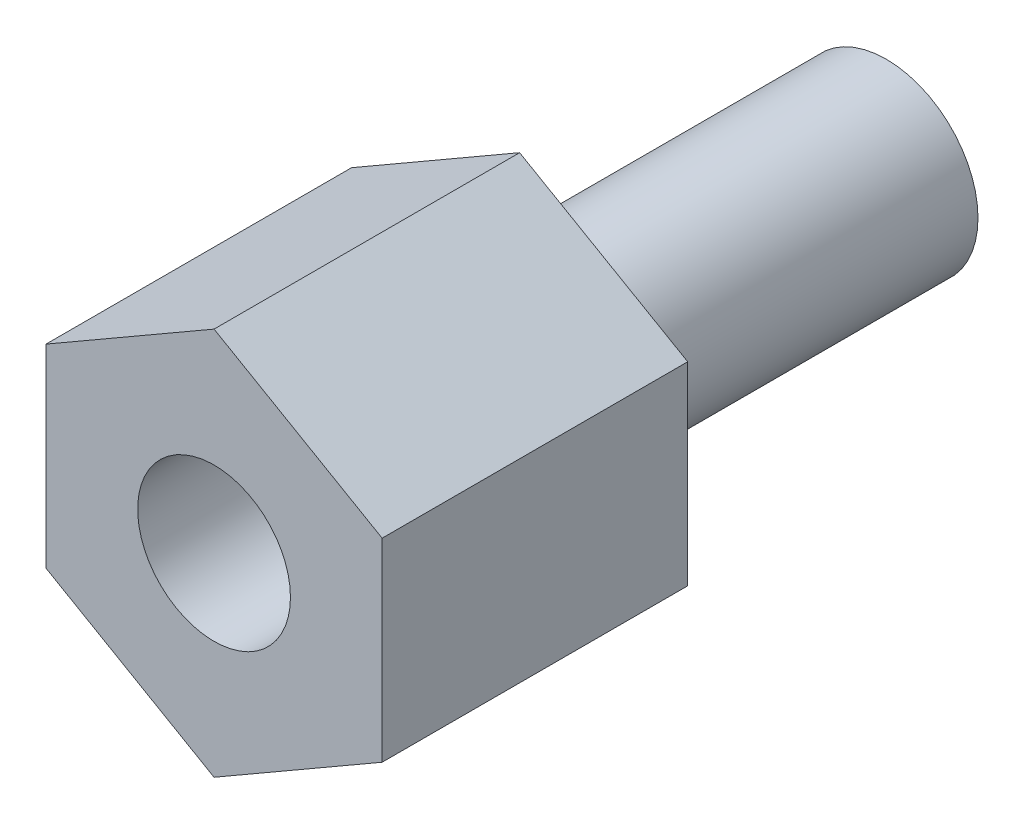
ISO-10303-21;
HEADER;
FILE_DESCRIPTION(('STEP AP214'),'2;1');
FILE_NAME('part.step','',(''),(''),'','','');
FILE_SCHEMA(('AUTOMOTIVE_DESIGN { 1 0 10303 214 1 1 1 1 }'));
ENDSEC;
DATA;
#1=APPLICATION_CONTEXT('core data for automotive mechanical design processes');
#2=APPLICATION_PROTOCOL_DEFINITION('international standard','automotive_design',2000,#1);
#3=PRODUCT_CONTEXT('',#1,'mechanical');
#4=PRODUCT('Part','Part','',(#3));
#5=PRODUCT_RELATED_PRODUCT_CATEGORY('part','',(#4));
#6=PRODUCT_DEFINITION_FORMATION('','',#4);
#7=PRODUCT_DEFINITION_CONTEXT('part definition',#1,'design');
#8=PRODUCT_DEFINITION('design','',#6,#7);
#9=PRODUCT_DEFINITION_SHAPE('','',#8);
#10=(LENGTH_UNIT() NAMED_UNIT(*) SI_UNIT(.MILLI.,.METRE.));
#11=(NAMED_UNIT(*) PLANE_ANGLE_UNIT() SI_UNIT($,.RADIAN.));
#12=(NAMED_UNIT(*) SI_UNIT($,.STERADIAN.) SOLID_ANGLE_UNIT());
#13=UNCERTAINTY_MEASURE_WITH_UNIT(LENGTH_MEASURE(1.E-05),#10,'distance_accuracy_value','');
#14=(GEOMETRIC_REPRESENTATION_CONTEXT(3) GLOBAL_UNCERTAINTY_ASSIGNED_CONTEXT((#13)) GLOBAL_UNIT_ASSIGNED_CONTEXT((#10,
#11,#12)) REPRESENTATION_CONTEXT('',''));
#15=CARTESIAN_POINT('',(0.,0.,0.));
#16=DIRECTION('',(0.,0.,1.));
#17=DIRECTION('',(1.,0.,0.));
#18=AXIS2_PLACEMENT_3D('',#15,#16,#17);
#19=CARTESIAN_POINT('',(0.,3.17542648054294,5.));
#20=DIRECTION('',(-0.5,-0.866025403784439,0.));
#21=DIRECTION('',(0.866025403784439,-0.5,0.));
#22=AXIS2_PLACEMENT_3D('',#19,#20,#21);
#23=PLANE('',#22);
#24=DIRECTION('',(-0.866025403784438,0.5,0.));
#25=VECTOR('',#24,1.);
#26=CARTESIAN_POINT('',(0.,3.17542648054294,0.));
#27=LINE('',#26,#25);
#28=CARTESIAN_POINT('',(2.75,1.58771324027147,0.));
#29=VERTEX_POINT('',#28);
#30=CARTESIAN_POINT('',(0.,3.17542648054294,0.));
#31=VERTEX_POINT('',#30);
#32=EDGE_CURVE('E146',#29,#31,#27,.T.);
#33=ORIENTED_EDGE('',*,*,#32,.T.);
#34=DIRECTION('',(0.,0.,-1.));
#35=VECTOR('',#34,1.);
#36=CARTESIAN_POINT('',(0.,3.17542648054294,5.));
#37=LINE('',#36,#35);
#38=CARTESIAN_POINT('',(0.,3.17542648054294,5.));
#39=VERTEX_POINT('',#38);
#40=EDGE_CURVE('E11',#39,#31,#37,.T.);
#41=ORIENTED_EDGE('',*,*,#40,.F.);
#42=DIRECTION('',(-0.866025403784438,0.5,0.));
#43=VECTOR('',#42,1.);
#44=CARTESIAN_POINT('',(0.,3.17542648054294,5.));
#45=LINE('',#44,#43);
#46=CARTESIAN_POINT('',(2.75,1.58771324027147,5.));
#47=VERTEX_POINT('',#46);
#48=EDGE_CURVE('E163',#47,#39,#45,.T.);
#49=ORIENTED_EDGE('',*,*,#48,.F.);
#50=DIRECTION('',(0.,0.,-1.));
#51=VECTOR('',#50,1.);
#52=CARTESIAN_POINT('',(2.75,1.58771324027147,5.));
#53=LINE('',#52,#51);
#54=EDGE_CURVE('E142',#47,#29,#53,.T.);
#55=ORIENTED_EDGE('',*,*,#54,.T.);
#56=EDGE_LOOP('',(#33,#41,#49,#55));
#57=FACE_BOUND('',#56,.T.);
#58=ADVANCED_FACE('F43',(#57),#23,.F.);
#59=CARTESIAN_POINT('',(-2.75,1.58771324027147,5.));
#60=DIRECTION('',(0.5,-0.866025403784439,0.));
#61=DIRECTION('',(0.866025403784439,0.5,0.));
#62=AXIS2_PLACEMENT_3D('',#59,#60,#61);
#63=PLANE('',#62);
#64=DIRECTION('',(-0.866025403784439,-0.5,0.));
#65=VECTOR('',#64,1.);
#66=CARTESIAN_POINT('',(-2.75,1.58771324027147,0.));
#67=LINE('',#66,#65);
#68=CARTESIAN_POINT('',(-2.75,1.58771324027147,0.));
#69=VERTEX_POINT('',#68);
#70=EDGE_CURVE('E150',#31,#69,#67,.T.);
#71=ORIENTED_EDGE('',*,*,#70,.T.);
#72=DIRECTION('',(0.,0.,-1.));
#73=VECTOR('',#72,1.);
#74=CARTESIAN_POINT('',(-2.75,1.58771324027147,5.));
#75=LINE('',#74,#73);
#76=CARTESIAN_POINT('',(-2.75,1.58771324027147,5.));
#77=VERTEX_POINT('',#76);
#78=EDGE_CURVE('E52',#77,#69,#75,.T.);
#79=ORIENTED_EDGE('',*,*,#78,.F.);
#80=DIRECTION('',(-0.866025403784439,-0.5,0.));
#81=VECTOR('',#80,1.);
#82=CARTESIAN_POINT('',(-2.75,1.58771324027147,5.));
#83=LINE('',#82,#81);
#84=EDGE_CURVE('E107',#39,#77,#83,.T.);
#85=ORIENTED_EDGE('',*,*,#84,.F.);
#86=ORIENTED_EDGE('',*,*,#40,.T.);
#87=EDGE_LOOP('',(#71,#79,#85,#86));
#88=FACE_BOUND('',#87,.T.);
#89=ADVANCED_FACE('F192',(#88),#63,.F.);
#90=CARTESIAN_POINT('',(-2.75,-1.58771324027147,5.));
#91=DIRECTION('',(1.,0.,0.));
#92=DIRECTION('',(0.,1.,0.));
#93=AXIS2_PLACEMENT_3D('',#90,#91,#92);
#94=PLANE('',#93);
#95=DIRECTION('',(0.,-1.,0.));
#96=VECTOR('',#95,1.);
#97=CARTESIAN_POINT('',(-2.75,-1.58771324027147,0.));
#98=LINE('',#97,#96);
#99=CARTESIAN_POINT('',(-2.75,-1.58771324027147,0.));
#100=VERTEX_POINT('',#99);
#101=EDGE_CURVE('E154',#69,#100,#98,.T.);
#102=ORIENTED_EDGE('',*,*,#101,.T.);
#103=DIRECTION('',(0.,0.,-1.));
#104=VECTOR('',#103,1.);
#105=CARTESIAN_POINT('',(-2.75,-1.58771324027147,5.));
#106=LINE('',#105,#104);
#107=CARTESIAN_POINT('',(-2.75,-1.58771324027147,5.));
#108=VERTEX_POINT('',#107);
#109=EDGE_CURVE('E133',#108,#100,#106,.T.);
#110=ORIENTED_EDGE('',*,*,#109,.F.);
#111=DIRECTION('',(0.,-1.,0.));
#112=VECTOR('',#111,1.);
#113=CARTESIAN_POINT('',(-2.75,-1.58771324027147,5.));
#114=LINE('',#113,#112);
#115=EDGE_CURVE('E122',#77,#108,#114,.T.);
#116=ORIENTED_EDGE('',*,*,#115,.F.);
#117=ORIENTED_EDGE('',*,*,#78,.T.);
#118=EDGE_LOOP('',(#102,#110,#116,#117));
#119=FACE_BOUND('',#118,.T.);
#120=ADVANCED_FACE('F173',(#119),#94,.F.);
#121=CARTESIAN_POINT('',(0.,-3.17542648054294,5.));
#122=DIRECTION('',(0.5,0.866025403784439,0.));
#123=DIRECTION('',(-0.866025403784439,0.5,0.));
#124=AXIS2_PLACEMENT_3D('',#121,#122,#123);
#125=PLANE('',#124);
#126=DIRECTION('',(0.866025403784438,-0.5,0.));
#127=VECTOR('',#126,1.);
#128=CARTESIAN_POINT('',(0.,-3.17542648054294,0.));
#129=LINE('',#128,#127);
#130=CARTESIAN_POINT('',(0.,-3.17542648054294,0.));
#131=VERTEX_POINT('',#130);
#132=EDGE_CURVE('E131',#100,#131,#129,.T.);
#133=ORIENTED_EDGE('',*,*,#132,.T.);
#134=DIRECTION('',(0.,0.,-1.));
#135=VECTOR('',#134,1.);
#136=CARTESIAN_POINT('',(0.,-3.17542648054294,5.));
#137=LINE('',#136,#135);
#138=CARTESIAN_POINT('',(0.,-3.17542648054294,5.));
#139=VERTEX_POINT('',#138);
#140=EDGE_CURVE('E128',#139,#131,#137,.T.);
#141=ORIENTED_EDGE('',*,*,#140,.F.);
#142=DIRECTION('',(0.866025403784438,-0.5,0.));
#143=VECTOR('',#142,1.);
#144=CARTESIAN_POINT('',(0.,-3.17542648054294,5.));
#145=LINE('',#144,#143);
#146=EDGE_CURVE('E116',#108,#139,#145,.T.);
#147=ORIENTED_EDGE('',*,*,#146,.F.);
#148=ORIENTED_EDGE('',*,*,#109,.T.);
#149=EDGE_LOOP('',(#133,#141,#147,#148));
#150=FACE_BOUND('',#149,.T.);
#151=ADVANCED_FACE('F129',(#150),#125,.F.);
#152=CARTESIAN_POINT('',(2.75,-1.58771324027147,5.));
#153=DIRECTION('',(-0.5,0.866025403784439,0.));
#154=DIRECTION('',(-0.866025403784439,-0.5,0.));
#155=AXIS2_PLACEMENT_3D('',#152,#153,#154);
#156=PLANE('',#155);
#157=DIRECTION('',(0.866025403784438,0.5,0.));
#158=VECTOR('',#157,1.);
#159=CARTESIAN_POINT('',(2.75,-1.58771324027147,0.));
#160=LINE('',#159,#158);
#161=CARTESIAN_POINT('',(2.75,-1.58771324027147,0.));
#162=VERTEX_POINT('',#161);
#163=EDGE_CURVE('E92',#131,#162,#160,.T.);
#164=ORIENTED_EDGE('',*,*,#163,.T.);
#165=DIRECTION('',(0.,0.,-1.));
#166=VECTOR('',#165,1.);
#167=CARTESIAN_POINT('',(2.75,-1.58771324027147,5.));
#168=LINE('',#167,#166);
#169=CARTESIAN_POINT('',(2.75,-1.58771324027147,5.));
#170=VERTEX_POINT('',#169);
#171=EDGE_CURVE('E134',#170,#162,#168,.T.);
#172=ORIENTED_EDGE('',*,*,#171,.F.);
#173=DIRECTION('',(0.866025403784438,0.5,0.));
#174=VECTOR('',#173,1.);
#175=CARTESIAN_POINT('',(2.75,-1.58771324027147,5.));
#176=LINE('',#175,#174);
#177=EDGE_CURVE('E120',#139,#170,#176,.T.);
#178=ORIENTED_EDGE('',*,*,#177,.F.);
#179=ORIENTED_EDGE('',*,*,#140,.T.);
#180=EDGE_LOOP('',(#164,#172,#178,#179));
#181=FACE_BOUND('',#180,.T.);
#182=ADVANCED_FACE('F136',(#181),#156,.F.);
#183=CARTESIAN_POINT('',(2.75,1.58771324027147,5.));
#184=DIRECTION('',(-1.,0.,0.));
#185=DIRECTION('',(0.,0.,1.));
#186=AXIS2_PLACEMENT_3D('',#183,#184,#185);
#187=PLANE('',#186);
#188=DIRECTION('',(0.,1.,0.));
#189=VECTOR('',#188,1.);
#190=CARTESIAN_POINT('',(2.75,1.58771324027147,0.));
#191=LINE('',#190,#189);
#192=EDGE_CURVE('E98',#162,#29,#191,.T.);
#193=ORIENTED_EDGE('',*,*,#192,.T.);
#194=ORIENTED_EDGE('',*,*,#54,.F.);
#195=DIRECTION('',(0.,1.,0.));
#196=VECTOR('',#195,1.);
#197=CARTESIAN_POINT('',(2.75,1.58771324027147,5.));
#198=LINE('',#197,#196);
#199=EDGE_CURVE('E62',#170,#47,#198,.T.);
#200=ORIENTED_EDGE('',*,*,#199,.F.);
#201=ORIENTED_EDGE('',*,*,#171,.T.);
#202=EDGE_LOOP('',(#193,#194,#200,#201));
#203=FACE_BOUND('',#202,.T.);
#204=ADVANCED_FACE('F180',(#203),#187,.F.);
#205=CARTESIAN_POINT('',(0.,0.,5.));
#206=DIRECTION('',(0.,0.,-1.));
#207=DIRECTION('',(-1.,0.,0.));
#208=AXIS2_PLACEMENT_3D('',#205,#206,#207);
#209=PLANE('',#208);
#210=CARTESIAN_POINT('',(0.,0.,5.));
#211=DIRECTION('',(0.,0.,1.));
#212=DIRECTION('',(1.,0.,0.));
#213=AXIS2_PLACEMENT_3D('',#210,#211,#212);
#214=CIRCLE('',#213,1.25);
#215=CARTESIAN_POINT('',(1.25,0.,5.));
#216=VERTEX_POINT('',#215);
#217=EDGE_CURVE('E315',#216,#216,#214,.T.);
#218=ORIENTED_EDGE('',*,*,#217,.F.);
#219=EDGE_LOOP('',(#218));
#220=FACE_BOUND('',#219,.T.);
#221=ORIENTED_EDGE('',*,*,#48,.T.);
#222=ORIENTED_EDGE('',*,*,#84,.T.);
#223=ORIENTED_EDGE('',*,*,#115,.T.);
#224=ORIENTED_EDGE('',*,*,#146,.T.);
#225=ORIENTED_EDGE('',*,*,#177,.T.);
#226=ORIENTED_EDGE('',*,*,#199,.T.);
#227=EDGE_LOOP('',(#221,#222,#223,#224,#225,#226));
#228=FACE_BOUND('',#227,.T.);
#229=ADVANCED_FACE('F118',(#220,#228),#209,.F.);
#230=CARTESIAN_POINT('',(0.,0.,0.));
#231=DIRECTION('',(0.,0.,-1.));
#232=DIRECTION('',(-1.,0.,0.));
#233=AXIS2_PLACEMENT_3D('',#230,#231,#232);
#234=PLANE('',#233);
#235=CARTESIAN_POINT('',(0.,0.,0.));
#236=DIRECTION('',(0.,0.,1.));
#237=DIRECTION('',(1.,0.,0.));
#238=AXIS2_PLACEMENT_3D('',#235,#236,#237);
#239=CIRCLE('',#238,1.5);
#240=CARTESIAN_POINT('',(1.5,0.,0.));
#241=VERTEX_POINT('',#240);
#242=EDGE_CURVE('E318',#241,#241,#239,.T.);
#243=ORIENTED_EDGE('',*,*,#242,.T.);
#244=EDGE_LOOP('',(#243));
#245=FACE_BOUND('',#244,.T.);
#246=ORIENTED_EDGE('',*,*,#32,.F.);
#247=ORIENTED_EDGE('',*,*,#192,.F.);
#248=ORIENTED_EDGE('',*,*,#163,.F.);
#249=ORIENTED_EDGE('',*,*,#132,.F.);
#250=ORIENTED_EDGE('',*,*,#101,.F.);
#251=ORIENTED_EDGE('',*,*,#70,.F.);
#252=EDGE_LOOP('',(#246,#247,#248,#249,#250,#251));
#253=FACE_BOUND('',#252,.T.);
#254=ADVANCED_FACE('F176',(#245,#253),#234,.T.);
#255=CARTESIAN_POINT('',(0.,0.,-6.));
#256=DIRECTION('',(0.,0.,1.));
#257=DIRECTION('',(1.,0.,0.));
#258=AXIS2_PLACEMENT_3D('',#255,#256,#257);
#259=CYLINDRICAL_SURFACE('',#258,1.5);
#260=CARTESIAN_POINT('',(0.,0.,-6.));
#261=DIRECTION('',(0.,0.,1.));
#262=DIRECTION('',(1.,0.,0.));
#263=AXIS2_PLACEMENT_3D('',#260,#261,#262);
#264=CIRCLE('',#263,1.5);
#265=CARTESIAN_POINT('',(1.5,0.,-6.));
#266=VERTEX_POINT('',#265);
#267=EDGE_CURVE('E151',#266,#266,#264,.T.);
#268=ORIENTED_EDGE('',*,*,#267,.T.);
#269=EDGE_LOOP('',(#268));
#270=FACE_BOUND('',#269,.T.);
#271=ORIENTED_EDGE('',*,*,#242,.F.);
#272=EDGE_LOOP('',(#271));
#273=FACE_BOUND('',#272,.T.);
#274=ADVANCED_FACE('F226',(#270,#273),#259,.T.);
#275=CARTESIAN_POINT('',(0.,0.,-6.));
#276=DIRECTION('',(0.,0.,1.));
#277=DIRECTION('',(1.,0.,0.));
#278=AXIS2_PLACEMENT_3D('',#275,#276,#277);
#279=PLANE('',#278);
#280=ORIENTED_EDGE('',*,*,#267,.F.);
#281=EDGE_LOOP('',(#280));
#282=FACE_BOUND('',#281,.T.);
#283=ADVANCED_FACE('F236',(#282),#279,.F.);
#284=CARTESIAN_POINT('',(0.,0.,5.));
#285=DIRECTION('',(0.,0.,-1.));
#286=DIRECTION('',(-1.,0.,0.));
#287=AXIS2_PLACEMENT_3D('',#284,#285,#286);
#288=CYLINDRICAL_SURFACE('',#287,1.25);
#289=ORIENTED_EDGE('',*,*,#217,.T.);
#290=EDGE_LOOP('',(#289));
#291=FACE_BOUND('',#290,.T.);
#292=CARTESIAN_POINT('',(0.,0.,0.));
#293=DIRECTION('',(0.,0.,1.));
#294=DIRECTION('',(1.,0.,0.));
#295=AXIS2_PLACEMENT_3D('',#292,#293,#294);
#296=CIRCLE('',#295,1.25);
#297=CARTESIAN_POINT('',(1.25,0.,0.));
#298=VERTEX_POINT('',#297);
#299=EDGE_CURVE('E312',#298,#298,#296,.T.);
#300=ORIENTED_EDGE('',*,*,#299,.F.);
#301=EDGE_LOOP('',(#300));
#302=FACE_BOUND('',#301,.T.);
#303=ADVANCED_FACE('F247',(#291,#302),#288,.F.);
#304=CARTESIAN_POINT('',(0.,0.,0.));
#305=DIRECTION('',(0.,0.,1.));
#306=DIRECTION('',(1.,0.,0.));
#307=AXIS2_PLACEMENT_3D('',#304,#305,#306);
#308=PLANE('',#307);
#309=ORIENTED_EDGE('',*,*,#299,.T.);
#310=EDGE_LOOP('',(#309));
#311=FACE_BOUND('',#310,.T.);
#312=ADVANCED_FACE('F264',(#311),#308,.T.);
#313=CLOSED_SHELL('',(#58,#89,#120,#151,#182,#204,#229,#254,#274,#283,#303,#312));
#314=MANIFOLD_SOLID_BREP('B2',#313);
#315=ADVANCED_BREP_SHAPE_REPRESENTATION('',(#18,#314),#14);
#316=SHAPE_DEFINITION_REPRESENTATION(#9,#315);
ENDSEC;
END-ISO-10303-21;
